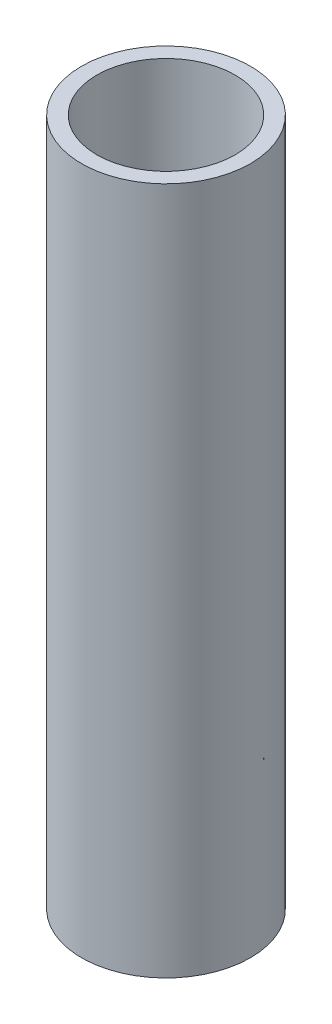
ISO-10303-21;
HEADER;
FILE_DESCRIPTION(('STEP AP214'),'2;1');
FILE_NAME('part.step','',(''),(''),'','','');
FILE_SCHEMA(('AUTOMOTIVE_DESIGN { 1 0 10303 214 1 1 1 1 }'));
ENDSEC;
DATA;
#1=APPLICATION_CONTEXT('core data for automotive mechanical design processes');
#2=APPLICATION_PROTOCOL_DEFINITION('international standard','automotive_design',2000,#1);
#3=PRODUCT_CONTEXT('',#1,'mechanical');
#4=PRODUCT('Part','Part','',(#3));
#5=PRODUCT_RELATED_PRODUCT_CATEGORY('part','',(#4));
#6=PRODUCT_DEFINITION_FORMATION('','',#4);
#7=PRODUCT_DEFINITION_CONTEXT('part definition',#1,'design');
#8=PRODUCT_DEFINITION('design','',#6,#7);
#9=PRODUCT_DEFINITION_SHAPE('','',#8);
#10=(LENGTH_UNIT() NAMED_UNIT(*) SI_UNIT(.MILLI.,.METRE.));
#11=(NAMED_UNIT(*) PLANE_ANGLE_UNIT() SI_UNIT($,.RADIAN.));
#12=(NAMED_UNIT(*) SI_UNIT($,.STERADIAN.) SOLID_ANGLE_UNIT());
#13=UNCERTAINTY_MEASURE_WITH_UNIT(LENGTH_MEASURE(1.E-05),#10,'distance_accuracy_value','');
#14=(GEOMETRIC_REPRESENTATION_CONTEXT(3) GLOBAL_UNCERTAINTY_ASSIGNED_CONTEXT((#13)) GLOBAL_UNIT_ASSIGNED_CONTEXT((#10,
#11,#12)) REPRESENTATION_CONTEXT('',''));
#15=CARTESIAN_POINT('',(0.,0.,0.));
#16=DIRECTION('',(0.,0.,1.));
#17=DIRECTION('',(1.,0.,0.));
#18=AXIS2_PLACEMENT_3D('',#15,#16,#17);
#19=CARTESIAN_POINT('',(0.699999999999994,37.4526670338006,-1.6));
#20=DIRECTION('',(0.,-1.,0.));
#21=DIRECTION('',(1.,0.,0.));
#22=AXIS2_PLACEMENT_3D('',#19,#20,#21);
#23=PLANE('',#22);
#24=CARTESIAN_POINT('',(0.699999999999994,37.4526670338006,-1.6));
#25=DIRECTION('',(0.,-1.,0.));
#26=DIRECTION('',(1.,0.,0.));
#27=AXIS2_PLACEMENT_3D('',#24,#25,#26);
#28=CIRCLE('',#27,0.7366);
#29=CARTESIAN_POINT('',(1.43659999999999,37.4526670338006,-1.6));
#30=VERTEX_POINT('',#29);
#31=EDGE_CURVE('E38',#30,#30,#28,.T.);
#32=ORIENTED_EDGE('',*,*,#31,.F.);
#33=EDGE_LOOP('',(#32));
#34=FACE_BOUND('',#33,.T.);
#35=CARTESIAN_POINT('',(0.699999999999994,37.4526670338006,-1.6));
#36=DIRECTION('',(0.,-1.,0.));
#37=DIRECTION('',(1.,0.,0.));
#38=AXIS2_PLACEMENT_3D('',#35,#36,#37);
#39=CIRCLE('',#38,0.60325);
#40=CARTESIAN_POINT('',(1.30324999999999,37.4526670338006,-1.6));
#41=VERTEX_POINT('',#40);
#42=EDGE_CURVE('E47',#41,#41,#39,.T.);
#43=ORIENTED_EDGE('',*,*,#42,.T.);
#44=EDGE_LOOP('',(#43));
#45=FACE_BOUND('',#44,.T.);
#46=ADVANCED_FACE('F31',(#34,#45),#23,.F.);
#47=CARTESIAN_POINT('',(0.699999999999995,29.3692476137125,-1.6));
#48=DIRECTION('',(0.,1.,0.));
#49=DIRECTION('',(-1.,0.,0.));
#50=AXIS2_PLACEMENT_3D('',#47,#48,#49);
#51=CYLINDRICAL_SURFACE('',#50,0.7366);
#52=CARTESIAN_POINT('',(0.699999999999995,31.4526670338006,-1.6));
#53=DIRECTION('',(0.,1.,0.));
#54=DIRECTION('',(-1.,0.,0.));
#55=AXIS2_PLACEMENT_3D('',#52,#53,#54);
#56=CIRCLE('',#55,0.7366);
#57=CARTESIAN_POINT('',(-0.0366000000000054,31.4526670338006,-1.6));
#58=VERTEX_POINT('',#57);
#59=EDGE_CURVE('E42',#58,#58,#56,.T.);
#60=ORIENTED_EDGE('',*,*,#59,.T.);
#61=EDGE_LOOP('',(#60));
#62=FACE_BOUND('',#61,.T.);
#63=ORIENTED_EDGE('',*,*,#31,.T.);
#64=EDGE_LOOP('',(#63));
#65=FACE_BOUND('',#64,.T.);
#66=ADVANCED_FACE('F55',(#62,#65),#51,.T.);
#67=CARTESIAN_POINT('',(0.699999999999995,29.3692476137125,-1.6));
#68=DIRECTION('',(0.,1.,0.));
#69=DIRECTION('',(-1.,0.,0.));
#70=AXIS2_PLACEMENT_3D('',#67,#68,#69);
#71=CYLINDRICAL_SURFACE('',#70,0.60325);
#72=CARTESIAN_POINT('',(0.699999999999995,31.4526670338006,-1.6));
#73=DIRECTION('',(0.,1.,0.));
#74=DIRECTION('',(-1.,0.,0.));
#75=AXIS2_PLACEMENT_3D('',#72,#73,#74);
#76=CIRCLE('',#75,0.60325);
#77=CARTESIAN_POINT('',(0.0967499999999944,31.4526670338006,-1.6));
#78=VERTEX_POINT('',#77);
#79=EDGE_CURVE('E10',#78,#78,#76,.T.);
#80=ORIENTED_EDGE('',*,*,#79,.F.);
#81=EDGE_LOOP('',(#80));
#82=FACE_BOUND('',#81,.T.);
#83=ORIENTED_EDGE('',*,*,#42,.F.);
#84=EDGE_LOOP('',(#83));
#85=FACE_BOUND('',#84,.T.);
#86=ADVANCED_FACE('F53',(#82,#85),#71,.F.);
#87=CARTESIAN_POINT('',(-2.8,31.4526670338006,0.));
#88=DIRECTION('',(0.,1.,0.));
#89=DIRECTION('',(-1.,0.,0.));
#90=AXIS2_PLACEMENT_3D('',#87,#88,#89);
#91=PLANE('',#90);
#92=ORIENTED_EDGE('',*,*,#79,.T.);
#93=EDGE_LOOP('',(#92));
#94=FACE_BOUND('',#93,.T.);
#95=ORIENTED_EDGE('',*,*,#59,.F.);
#96=EDGE_LOOP('',(#95));
#97=FACE_BOUND('',#96,.T.);
#98=ADVANCED_FACE('F33',(#94,#97),#91,.F.);
#99=CLOSED_SHELL('',(#46,#66,#86,#98));
#100=MANIFOLD_SOLID_BREP('B2',#99);
#101=ADVANCED_BREP_SHAPE_REPRESENTATION('',(#18,#100),#14);
#102=SHAPE_DEFINITION_REPRESENTATION(#9,#101);
ENDSEC;
END-ISO-10303-21;
